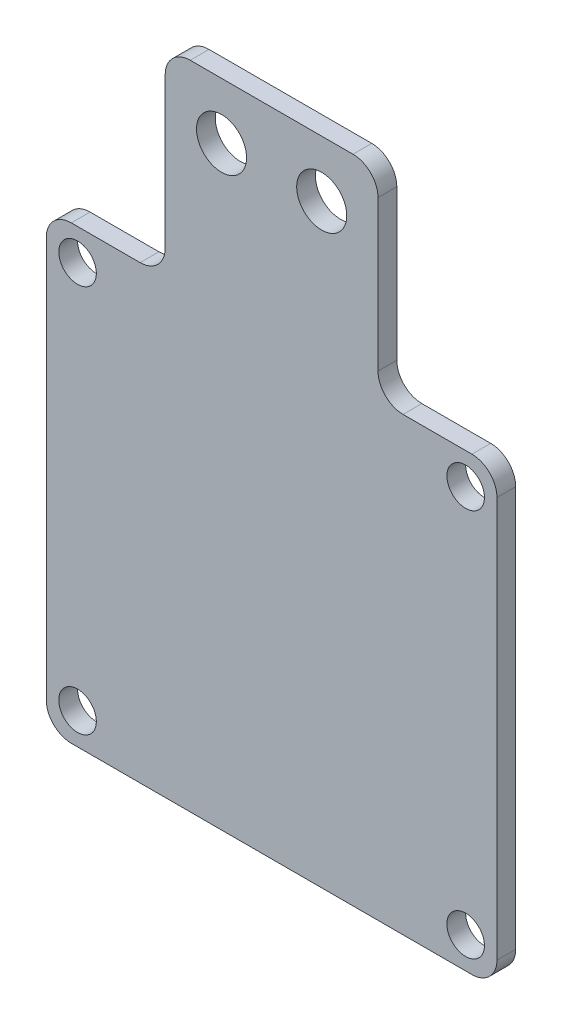
ISO-10303-21;
HEADER;
FILE_DESCRIPTION(('STEP AP214'),'2;1');
FILE_NAME('part.step','',(''),(''),'','','');
FILE_SCHEMA(('AUTOMOTIVE_DESIGN { 1 0 10303 214 1 1 1 1 }'));
ENDSEC;
DATA;
#1=APPLICATION_CONTEXT('core data for automotive mechanical design processes');
#2=APPLICATION_PROTOCOL_DEFINITION('international standard','automotive_design',2000,#1);
#3=PRODUCT_CONTEXT('',#1,'mechanical');
#4=PRODUCT('Part','Part','',(#3));
#5=PRODUCT_RELATED_PRODUCT_CATEGORY('part','',(#4));
#6=PRODUCT_DEFINITION_FORMATION('','',#4);
#7=PRODUCT_DEFINITION_CONTEXT('part definition',#1,'design');
#8=PRODUCT_DEFINITION('design','',#6,#7);
#9=PRODUCT_DEFINITION_SHAPE('','',#8);
#10=(LENGTH_UNIT() NAMED_UNIT(*) SI_UNIT(.MILLI.,.METRE.));
#11=(NAMED_UNIT(*) PLANE_ANGLE_UNIT() SI_UNIT($,.RADIAN.));
#12=(NAMED_UNIT(*) SI_UNIT($,.STERADIAN.) SOLID_ANGLE_UNIT());
#13=UNCERTAINTY_MEASURE_WITH_UNIT(LENGTH_MEASURE(1.E-05),#10,'distance_accuracy_value','');
#14=(GEOMETRIC_REPRESENTATION_CONTEXT(3) GLOBAL_UNCERTAINTY_ASSIGNED_CONTEXT((#13)) GLOBAL_UNIT_ASSIGNED_CONTEXT((#10,
#11,#12)) REPRESENTATION_CONTEXT('',''));
#15=CARTESIAN_POINT('',(0.,0.,0.));
#16=DIRECTION('',(0.,0.,1.));
#17=DIRECTION('',(1.,0.,0.));
#18=AXIS2_PLACEMENT_3D('',#15,#16,#17);
#19=CARTESIAN_POINT('',(10.5,38.,1.5));
#20=DIRECTION('',(0.,0.,1.));
#21=DIRECTION('',(1.,0.,0.));
#22=AXIS2_PLACEMENT_3D('',#19,#20,#21);
#23=PLANE('',#22);
#24=CARTESIAN_POINT('',(15.5,33.5,1.5));
#25=DIRECTION('',(0.,0.,1.));
#26=DIRECTION('',(-1.,0.,0.));
#27=AXIS2_PLACEMENT_3D('',#24,#25,#26);
#28=CIRCLE('',#27,1.5);
#29=CARTESIAN_POINT('',(14.,33.5,1.5));
#30=VERTEX_POINT('',#29);
#31=EDGE_CURVE('E354',#30,#30,#28,.T.);
#32=ORIENTED_EDGE('',*,*,#31,.F.);
#33=EDGE_LOOP('',(#32));
#34=FACE_BOUND('',#33,.T.);
#35=CARTESIAN_POINT('',(-4.,47.5,1.5));
#36=DIRECTION('',(0.,0.,1.));
#37=DIRECTION('',(1.,0.,0.));
#38=AXIS2_PLACEMENT_3D('',#35,#36,#37);
#39=CIRCLE('',#38,2.);
#40=CARTESIAN_POINT('',(-1.99999999999999,47.5,1.5));
#41=VERTEX_POINT('',#40);
#42=EDGE_CURVE('E366',#41,#41,#39,.T.);
#43=ORIENTED_EDGE('',*,*,#42,.F.);
#44=EDGE_LOOP('',(#43));
#45=FACE_BOUND('',#44,.T.);
#46=CARTESIAN_POINT('',(-15.5,2.5,1.5));
#47=DIRECTION('',(0.,0.,1.));
#48=DIRECTION('',(1.,0.,0.));
#49=AXIS2_PLACEMENT_3D('',#46,#47,#48);
#50=CIRCLE('',#49,1.5);
#51=CARTESIAN_POINT('',(-14.,2.5,1.5));
#52=VERTEX_POINT('',#51);
#53=EDGE_CURVE('E185',#52,#52,#50,.T.);
#54=ORIENTED_EDGE('',*,*,#53,.F.);
#55=EDGE_LOOP('',(#54));
#56=FACE_BOUND('',#55,.T.);
#57=CARTESIAN_POINT('',(10.5,38.,1.5));
#58=DIRECTION('',(0.,0.,-1.));
#59=DIRECTION('',(1.,0.,0.));
#60=AXIS2_PLACEMENT_3D('',#57,#58,#59);
#61=CIRCLE('',#60,2.);
#62=CARTESIAN_POINT('',(10.5,36.,1.5));
#63=VERTEX_POINT('',#62);
#64=CARTESIAN_POINT('',(8.5,38.,1.5));
#65=VERTEX_POINT('',#64);
#66=EDGE_CURVE('E214',#63,#65,#61,.T.);
#67=ORIENTED_EDGE('',*,*,#66,.T.);
#68=DIRECTION('',(0.,1.,0.));
#69=VECTOR('',#68,1.);
#70=CARTESIAN_POINT('',(8.5,38.,1.5));
#71=LINE('',#70,#69);
#72=CARTESIAN_POINT('',(8.5,50.,1.5));
#73=VERTEX_POINT('',#72);
#74=EDGE_CURVE('E120',#65,#73,#71,.T.);
#75=ORIENTED_EDGE('',*,*,#74,.T.);
#76=CARTESIAN_POINT('',(6.5,50.,1.5));
#77=DIRECTION('',(0.,0.,1.));
#78=DIRECTION('',(1.,0.,0.));
#79=AXIS2_PLACEMENT_3D('',#76,#77,#78);
#80=CIRCLE('',#79,2.);
#81=CARTESIAN_POINT('',(6.5,52.,1.5));
#82=VERTEX_POINT('',#81);
#83=EDGE_CURVE('E253',#73,#82,#80,.T.);
#84=ORIENTED_EDGE('',*,*,#83,.T.);
#85=DIRECTION('',(-1.,0.,0.));
#86=VECTOR('',#85,1.);
#87=CARTESIAN_POINT('',(6.5,52.,1.5));
#88=LINE('',#87,#86);
#89=CARTESIAN_POINT('',(-6.5,52.,1.5));
#90=VERTEX_POINT('',#89);
#91=EDGE_CURVE('E271',#82,#90,#88,.T.);
#92=ORIENTED_EDGE('',*,*,#91,.T.);
#93=CARTESIAN_POINT('',(-6.5,50.,1.5));
#94=DIRECTION('',(0.,0.,1.));
#95=DIRECTION('',(-1.,0.,0.));
#96=AXIS2_PLACEMENT_3D('',#93,#94,#95);
#97=CIRCLE('',#96,2.);
#98=CARTESIAN_POINT('',(-8.5,50.,1.5));
#99=VERTEX_POINT('',#98);
#100=EDGE_CURVE('E268',#90,#99,#97,.T.);
#101=ORIENTED_EDGE('',*,*,#100,.T.);
#102=DIRECTION('',(0.,-1.,0.));
#103=VECTOR('',#102,1.);
#104=CARTESIAN_POINT('',(-8.5,38.,1.5));
#105=LINE('',#104,#103);
#106=CARTESIAN_POINT('',(-8.5,38.,1.5));
#107=VERTEX_POINT('',#106);
#108=EDGE_CURVE('E270',#99,#107,#105,.T.);
#109=ORIENTED_EDGE('',*,*,#108,.T.);
#110=CARTESIAN_POINT('',(-10.5,38.,1.5));
#111=DIRECTION('',(0.,0.,-1.));
#112=DIRECTION('',(-1.,0.,0.));
#113=AXIS2_PLACEMENT_3D('',#110,#111,#112);
#114=CIRCLE('',#113,2.);
#115=CARTESIAN_POINT('',(-10.5,36.,1.5));
#116=VERTEX_POINT('',#115);
#117=EDGE_CURVE('E273',#107,#116,#114,.T.);
#118=ORIENTED_EDGE('',*,*,#117,.T.);
#119=DIRECTION('',(-1.,0.,0.));
#120=VECTOR('',#119,1.);
#121=CARTESIAN_POINT('',(-16.,36.,1.5));
#122=LINE('',#121,#120);
#123=CARTESIAN_POINT('',(-16.,36.,1.5));
#124=VERTEX_POINT('',#123);
#125=EDGE_CURVE('E279',#116,#124,#122,.T.);
#126=ORIENTED_EDGE('',*,*,#125,.T.);
#127=CARTESIAN_POINT('',(-16.,34.,1.5));
#128=DIRECTION('',(0.,0.,1.));
#129=DIRECTION('',(-1.,0.,0.));
#130=AXIS2_PLACEMENT_3D('',#127,#128,#129);
#131=CIRCLE('',#130,2.);
#132=CARTESIAN_POINT('',(-18.,34.,1.5));
#133=VERTEX_POINT('',#132);
#134=EDGE_CURVE('E281',#124,#133,#131,.T.);
#135=ORIENTED_EDGE('',*,*,#134,.T.);
#136=DIRECTION('',(0.,-1.,0.));
#137=VECTOR('',#136,1.);
#138=CARTESIAN_POINT('',(-18.,2.,1.5));
#139=LINE('',#138,#137);
#140=CARTESIAN_POINT('',(-18.,2.,1.5));
#141=VERTEX_POINT('',#140);
#142=EDGE_CURVE('E283',#133,#141,#139,.T.);
#143=ORIENTED_EDGE('',*,*,#142,.T.);
#144=CARTESIAN_POINT('',(-16.,2.,1.5));
#145=DIRECTION('',(0.,0.,1.));
#146=DIRECTION('',(-1.,0.,0.));
#147=AXIS2_PLACEMENT_3D('',#144,#145,#146);
#148=CIRCLE('',#147,2.);
#149=CARTESIAN_POINT('',(-16.,0.,1.5));
#150=VERTEX_POINT('',#149);
#151=EDGE_CURVE('E285',#141,#150,#148,.T.);
#152=ORIENTED_EDGE('',*,*,#151,.T.);
#153=DIRECTION('',(1.,0.,0.));
#154=VECTOR('',#153,1.);
#155=CARTESIAN_POINT('',(0.,0.,1.5));
#156=LINE('',#155,#154);
#157=CARTESIAN_POINT('',(16.,0.,1.5));
#158=VERTEX_POINT('',#157);
#159=EDGE_CURVE('E287',#150,#158,#156,.T.);
#160=ORIENTED_EDGE('',*,*,#159,.T.);
#161=CARTESIAN_POINT('',(16.,2.,1.5));
#162=DIRECTION('',(0.,0.,1.));
#163=DIRECTION('',(1.,0.,0.));
#164=AXIS2_PLACEMENT_3D('',#161,#162,#163);
#165=CIRCLE('',#164,2.);
#166=CARTESIAN_POINT('',(18.,2.,1.5));
#167=VERTEX_POINT('',#166);
#168=EDGE_CURVE('E163',#158,#167,#165,.T.);
#169=ORIENTED_EDGE('',*,*,#168,.T.);
#170=DIRECTION('',(0.,1.,0.));
#171=VECTOR('',#170,1.);
#172=CARTESIAN_POINT('',(18.,2.,1.5));
#173=LINE('',#172,#171);
#174=CARTESIAN_POINT('',(18.,34.,1.5));
#175=VERTEX_POINT('',#174);
#176=EDGE_CURVE('E157',#167,#175,#173,.T.);
#177=ORIENTED_EDGE('',*,*,#176,.T.);
#178=CARTESIAN_POINT('',(16.,34.,1.5));
#179=DIRECTION('',(0.,0.,1.));
#180=DIRECTION('',(1.,0.,0.));
#181=AXIS2_PLACEMENT_3D('',#178,#179,#180);
#182=CIRCLE('',#181,2.);
#183=CARTESIAN_POINT('',(16.,36.,1.5));
#184=VERTEX_POINT('',#183);
#185=EDGE_CURVE('E161',#175,#184,#182,.T.);
#186=ORIENTED_EDGE('',*,*,#185,.T.);
#187=DIRECTION('',(-1.,0.,0.));
#188=VECTOR('',#187,1.);
#189=CARTESIAN_POINT('',(16.,36.,1.5));
#190=LINE('',#189,#188);
#191=EDGE_CURVE('E53',#184,#63,#190,.T.);
#192=ORIENTED_EDGE('',*,*,#191,.T.);
#193=EDGE_LOOP('',(#67,#75,#84,#92,#101,#109,#118,#126,#135,#143,#152,#160,#169,#177,#186,#192));
#194=FACE_BOUND('',#193,.T.);
#195=CARTESIAN_POINT('',(-15.5,33.5,1.5));
#196=DIRECTION('',(0.,0.,1.));
#197=DIRECTION('',(1.,0.,0.));
#198=AXIS2_PLACEMENT_3D('',#195,#196,#197);
#199=CIRCLE('',#198,1.5);
#200=CARTESIAN_POINT('',(-14.,33.5,1.5));
#201=VERTEX_POINT('',#200);
#202=EDGE_CURVE('E372',#201,#201,#199,.T.);
#203=ORIENTED_EDGE('',*,*,#202,.F.);
#204=EDGE_LOOP('',(#203));
#205=FACE_BOUND('',#204,.T.);
#206=CARTESIAN_POINT('',(4.,47.5,1.5));
#207=DIRECTION('',(0.,0.,1.));
#208=DIRECTION('',(-1.,0.,0.));
#209=AXIS2_PLACEMENT_3D('',#206,#207,#208);
#210=CIRCLE('',#209,2.);
#211=CARTESIAN_POINT('',(1.99999999999999,47.5,1.5));
#212=VERTEX_POINT('',#211);
#213=EDGE_CURVE('E360',#212,#212,#210,.T.);
#214=ORIENTED_EDGE('',*,*,#213,.F.);
#215=EDGE_LOOP('',(#214));
#216=FACE_BOUND('',#215,.T.);
#217=CARTESIAN_POINT('',(15.5,2.5,1.5));
#218=DIRECTION('',(0.,0.,1.));
#219=DIRECTION('',(-1.,0.,0.));
#220=AXIS2_PLACEMENT_3D('',#217,#218,#219);
#221=CIRCLE('',#220,1.5);
#222=CARTESIAN_POINT('',(14.,2.5,1.5));
#223=VERTEX_POINT('',#222);
#224=EDGE_CURVE('E345',#223,#223,#221,.T.);
#225=ORIENTED_EDGE('',*,*,#224,.F.);
#226=EDGE_LOOP('',(#225));
#227=FACE_BOUND('',#226,.T.);
#228=ADVANCED_FACE('F36',(#34,#45,#56,#194,#205,#216,#227),#23,.T.);
#229=CARTESIAN_POINT('',(10.5,38.,0.));
#230=DIRECTION('',(0.,0.,1.));
#231=DIRECTION('',(1.,0.,0.));
#232=AXIS2_PLACEMENT_3D('',#229,#230,#231);
#233=PLANE('',#232);
#234=CARTESIAN_POINT('',(10.5,38.,0.));
#235=DIRECTION('',(0.,0.,-1.));
#236=DIRECTION('',(1.,0.,0.));
#237=AXIS2_PLACEMENT_3D('',#234,#235,#236);
#238=CIRCLE('',#237,2.);
#239=CARTESIAN_POINT('',(10.5,36.,0.));
#240=VERTEX_POINT('',#239);
#241=CARTESIAN_POINT('',(8.5,38.,0.));
#242=VERTEX_POINT('',#241);
#243=EDGE_CURVE('E181',#240,#242,#238,.T.);
#244=ORIENTED_EDGE('',*,*,#243,.F.);
#245=DIRECTION('',(-1.,0.,0.));
#246=VECTOR('',#245,1.);
#247=CARTESIAN_POINT('',(16.,36.,0.));
#248=LINE('',#247,#246);
#249=CARTESIAN_POINT('',(16.,36.,0.));
#250=VERTEX_POINT('',#249);
#251=EDGE_CURVE('E112',#250,#240,#248,.T.);
#252=ORIENTED_EDGE('',*,*,#251,.F.);
#253=CARTESIAN_POINT('',(16.,34.,0.));
#254=DIRECTION('',(0.,0.,1.));
#255=DIRECTION('',(1.,0.,0.));
#256=AXIS2_PLACEMENT_3D('',#253,#254,#255);
#257=CIRCLE('',#256,2.);
#258=CARTESIAN_POINT('',(18.,34.,0.));
#259=VERTEX_POINT('',#258);
#260=EDGE_CURVE('E106',#259,#250,#257,.T.);
#261=ORIENTED_EDGE('',*,*,#260,.F.);
#262=DIRECTION('',(0.,1.,0.));
#263=VECTOR('',#262,1.);
#264=CARTESIAN_POINT('',(18.,2.,0.));
#265=LINE('',#264,#263);
#266=CARTESIAN_POINT('',(18.,2.,0.));
#267=VERTEX_POINT('',#266);
#268=EDGE_CURVE('E171',#267,#259,#265,.T.);
#269=ORIENTED_EDGE('',*,*,#268,.F.);
#270=CARTESIAN_POINT('',(16.,2.,0.));
#271=DIRECTION('',(0.,0.,1.));
#272=DIRECTION('',(1.,0.,0.));
#273=AXIS2_PLACEMENT_3D('',#270,#271,#272);
#274=CIRCLE('',#273,2.);
#275=CARTESIAN_POINT('',(16.,0.,0.));
#276=VERTEX_POINT('',#275);
#277=EDGE_CURVE('E209',#276,#267,#274,.T.);
#278=ORIENTED_EDGE('',*,*,#277,.F.);
#279=DIRECTION('',(1.,0.,0.));
#280=VECTOR('',#279,1.);
#281=CARTESIAN_POINT('',(0.,0.,0.));
#282=LINE('',#281,#280);
#283=CARTESIAN_POINT('',(-16.,0.,0.));
#284=VERTEX_POINT('',#283);
#285=EDGE_CURVE('E207',#284,#276,#282,.T.);
#286=ORIENTED_EDGE('',*,*,#285,.F.);
#287=CARTESIAN_POINT('',(-16.,2.,0.));
#288=DIRECTION('',(0.,0.,1.));
#289=DIRECTION('',(-1.,0.,0.));
#290=AXIS2_PLACEMENT_3D('',#287,#288,#289);
#291=CIRCLE('',#290,2.);
#292=CARTESIAN_POINT('',(-18.,2.,0.));
#293=VERTEX_POINT('',#292);
#294=EDGE_CURVE('E204',#293,#284,#291,.T.);
#295=ORIENTED_EDGE('',*,*,#294,.F.);
#296=DIRECTION('',(0.,-1.,0.));
#297=VECTOR('',#296,1.);
#298=CARTESIAN_POINT('',(-18.,2.,0.));
#299=LINE('',#298,#297);
#300=CARTESIAN_POINT('',(-18.,34.,0.));
#301=VERTEX_POINT('',#300);
#302=EDGE_CURVE('E202',#301,#293,#299,.T.);
#303=ORIENTED_EDGE('',*,*,#302,.F.);
#304=CARTESIAN_POINT('',(-16.,34.,0.));
#305=DIRECTION('',(0.,0.,1.));
#306=DIRECTION('',(-1.,0.,0.));
#307=AXIS2_PLACEMENT_3D('',#304,#305,#306);
#308=CIRCLE('',#307,2.);
#309=CARTESIAN_POINT('',(-16.,36.,0.));
#310=VERTEX_POINT('',#309);
#311=EDGE_CURVE('E200',#310,#301,#308,.T.);
#312=ORIENTED_EDGE('',*,*,#311,.F.);
#313=DIRECTION('',(-1.,0.,0.));
#314=VECTOR('',#313,1.);
#315=CARTESIAN_POINT('',(-16.,36.,0.));
#316=LINE('',#315,#314);
#317=CARTESIAN_POINT('',(-10.5,36.,0.));
#318=VERTEX_POINT('',#317);
#319=EDGE_CURVE('E198',#318,#310,#316,.T.);
#320=ORIENTED_EDGE('',*,*,#319,.F.);
#321=CARTESIAN_POINT('',(-10.5,38.,0.));
#322=DIRECTION('',(0.,0.,-1.));
#323=DIRECTION('',(-1.,0.,0.));
#324=AXIS2_PLACEMENT_3D('',#321,#322,#323);
#325=CIRCLE('',#324,2.);
#326=CARTESIAN_POINT('',(-8.5,38.,0.));
#327=VERTEX_POINT('',#326);
#328=EDGE_CURVE('E196',#327,#318,#325,.T.);
#329=ORIENTED_EDGE('',*,*,#328,.F.);
#330=DIRECTION('',(0.,-1.,0.));
#331=VECTOR('',#330,1.);
#332=CARTESIAN_POINT('',(-8.5,38.,0.));
#333=LINE('',#332,#331);
#334=CARTESIAN_POINT('',(-8.5,50.,0.));
#335=VERTEX_POINT('',#334);
#336=EDGE_CURVE('E194',#335,#327,#333,.T.);
#337=ORIENTED_EDGE('',*,*,#336,.F.);
#338=CARTESIAN_POINT('',(-6.5,50.,0.));
#339=DIRECTION('',(0.,0.,1.));
#340=DIRECTION('',(-1.,0.,0.));
#341=AXIS2_PLACEMENT_3D('',#338,#339,#340);
#342=CIRCLE('',#341,2.);
#343=CARTESIAN_POINT('',(-6.5,52.,0.));
#344=VERTEX_POINT('',#343);
#345=EDGE_CURVE('E192',#344,#335,#342,.T.);
#346=ORIENTED_EDGE('',*,*,#345,.F.);
#347=DIRECTION('',(-1.,0.,0.));
#348=VECTOR('',#347,1.);
#349=CARTESIAN_POINT('',(-6.5,52.,0.));
#350=LINE('',#349,#348);
#351=CARTESIAN_POINT('',(6.5,52.,0.));
#352=VERTEX_POINT('',#351);
#353=EDGE_CURVE('E190',#352,#344,#350,.T.);
#354=ORIENTED_EDGE('',*,*,#353,.F.);
#355=CARTESIAN_POINT('',(6.5,50.,0.));
#356=DIRECTION('',(0.,0.,1.));
#357=DIRECTION('',(1.,0.,0.));
#358=AXIS2_PLACEMENT_3D('',#355,#356,#357);
#359=CIRCLE('',#358,2.);
#360=CARTESIAN_POINT('',(8.5,50.,0.));
#361=VERTEX_POINT('',#360);
#362=EDGE_CURVE('E187',#361,#352,#359,.T.);
#363=ORIENTED_EDGE('',*,*,#362,.F.);
#364=DIRECTION('',(0.,1.,0.));
#365=VECTOR('',#364,1.);
#366=CARTESIAN_POINT('',(8.5,38.,0.));
#367=LINE('',#366,#365);
#368=EDGE_CURVE('E184',#242,#361,#367,.T.);
#369=ORIENTED_EDGE('',*,*,#368,.F.);
#370=EDGE_LOOP('',(#244,#252,#261,#269,#278,#286,#295,#303,#312,#320,#329,#337,#346,#354,#363,#369));
#371=FACE_BOUND('',#370,.T.);
#372=CARTESIAN_POINT('',(-15.5,2.5,0.));
#373=DIRECTION('',(0.,0.,1.));
#374=DIRECTION('',(1.,0.,0.));
#375=AXIS2_PLACEMENT_3D('',#372,#373,#374);
#376=CIRCLE('',#375,1.5);
#377=CARTESIAN_POINT('',(-14.,2.5,0.));
#378=VERTEX_POINT('',#377);
#379=EDGE_CURVE('E375',#378,#378,#376,.T.);
#380=ORIENTED_EDGE('',*,*,#379,.T.);
#381=EDGE_LOOP('',(#380));
#382=FACE_BOUND('',#381,.T.);
#383=CARTESIAN_POINT('',(-15.5,33.5,0.));
#384=DIRECTION('',(0.,0.,1.));
#385=DIRECTION('',(1.,0.,0.));
#386=AXIS2_PLACEMENT_3D('',#383,#384,#385);
#387=CIRCLE('',#386,1.5);
#388=CARTESIAN_POINT('',(-14.,33.5,0.));
#389=VERTEX_POINT('',#388);
#390=EDGE_CURVE('E369',#389,#389,#387,.T.);
#391=ORIENTED_EDGE('',*,*,#390,.T.);
#392=EDGE_LOOP('',(#391));
#393=FACE_BOUND('',#392,.T.);
#394=CARTESIAN_POINT('',(-4.,47.5,0.));
#395=DIRECTION('',(0.,0.,1.));
#396=DIRECTION('',(1.,0.,0.));
#397=AXIS2_PLACEMENT_3D('',#394,#395,#396);
#398=CIRCLE('',#397,2.);
#399=CARTESIAN_POINT('',(-1.99999999999999,47.5,0.));
#400=VERTEX_POINT('',#399);
#401=EDGE_CURVE('E363',#400,#400,#398,.T.);
#402=ORIENTED_EDGE('',*,*,#401,.T.);
#403=EDGE_LOOP('',(#402));
#404=FACE_BOUND('',#403,.T.);
#405=CARTESIAN_POINT('',(4.,47.5,0.));
#406=DIRECTION('',(0.,0.,1.));
#407=DIRECTION('',(-1.,0.,0.));
#408=AXIS2_PLACEMENT_3D('',#405,#406,#407);
#409=CIRCLE('',#408,2.);
#410=CARTESIAN_POINT('',(1.99999999999999,47.5,0.));
#411=VERTEX_POINT('',#410);
#412=EDGE_CURVE('E357',#411,#411,#409,.T.);
#413=ORIENTED_EDGE('',*,*,#412,.T.);
#414=EDGE_LOOP('',(#413));
#415=FACE_BOUND('',#414,.T.);
#416=CARTESIAN_POINT('',(15.5,33.5,0.));
#417=DIRECTION('',(0.,0.,1.));
#418=DIRECTION('',(-1.,0.,0.));
#419=AXIS2_PLACEMENT_3D('',#416,#417,#418);
#420=CIRCLE('',#419,1.5);
#421=CARTESIAN_POINT('',(14.,33.5,0.));
#422=VERTEX_POINT('',#421);
#423=EDGE_CURVE('E351',#422,#422,#420,.T.);
#424=ORIENTED_EDGE('',*,*,#423,.T.);
#425=EDGE_LOOP('',(#424));
#426=FACE_BOUND('',#425,.T.);
#427=CARTESIAN_POINT('',(15.5,2.5,0.));
#428=DIRECTION('',(0.,0.,1.));
#429=DIRECTION('',(-1.,0.,0.));
#430=AXIS2_PLACEMENT_3D('',#427,#428,#429);
#431=CIRCLE('',#430,1.5);
#432=CARTESIAN_POINT('',(14.,2.5,0.));
#433=VERTEX_POINT('',#432);
#434=EDGE_CURVE('E348',#433,#433,#431,.T.);
#435=ORIENTED_EDGE('',*,*,#434,.T.);
#436=EDGE_LOOP('',(#435));
#437=FACE_BOUND('',#436,.T.);
#438=ADVANCED_FACE('F256',(#371,#382,#393,#404,#415,#426,#437),#233,.F.);
#439=CARTESIAN_POINT('',(10.5,38.,1.5));
#440=DIRECTION('',(0.,0.,-1.));
#441=DIRECTION('',(-1.,0.,0.));
#442=AXIS2_PLACEMENT_3D('',#439,#440,#441);
#443=CYLINDRICAL_SURFACE('',#442,2.);
#444=ORIENTED_EDGE('',*,*,#243,.T.);
#445=DIRECTION('',(0.,0.,-1.));
#446=VECTOR('',#445,1.);
#447=CARTESIAN_POINT('',(8.5,38.,1.5));
#448=LINE('',#447,#446);
#449=EDGE_CURVE('E11',#65,#242,#448,.T.);
#450=ORIENTED_EDGE('',*,*,#449,.F.);
#451=ORIENTED_EDGE('',*,*,#66,.F.);
#452=DIRECTION('',(0.,0.,-1.));
#453=VECTOR('',#452,1.);
#454=CARTESIAN_POINT('',(10.5,36.,1.5));
#455=LINE('',#454,#453);
#456=EDGE_CURVE('E177',#63,#240,#455,.T.);
#457=ORIENTED_EDGE('',*,*,#456,.T.);
#458=EDGE_LOOP('',(#444,#450,#451,#457));
#459=FACE_BOUND('',#458,.T.);
#460=ADVANCED_FACE('F38',(#459),#443,.F.);
#461=CARTESIAN_POINT('',(8.5,38.,1.5));
#462=DIRECTION('',(-1.,0.,0.));
#463=DIRECTION('',(0.,0.,1.));
#464=AXIS2_PLACEMENT_3D('',#461,#462,#463);
#465=PLANE('',#464);
#466=ORIENTED_EDGE('',*,*,#368,.T.);
#467=DIRECTION('',(0.,0.,-1.));
#468=VECTOR('',#467,1.);
#469=CARTESIAN_POINT('',(8.5,50.,1.5));
#470=LINE('',#469,#468);
#471=EDGE_CURVE('E45',#73,#361,#470,.T.);
#472=ORIENTED_EDGE('',*,*,#471,.F.);
#473=ORIENTED_EDGE('',*,*,#74,.F.);
#474=ORIENTED_EDGE('',*,*,#449,.T.);
#475=EDGE_LOOP('',(#466,#472,#473,#474));
#476=FACE_BOUND('',#475,.T.);
#477=ADVANCED_FACE('F545',(#476),#465,.F.);
#478=CARTESIAN_POINT('',(6.5,50.,1.5));
#479=DIRECTION('',(0.,0.,-1.));
#480=DIRECTION('',(-1.,0.,0.));
#481=AXIS2_PLACEMENT_3D('',#478,#479,#480);
#482=CYLINDRICAL_SURFACE('',#481,2.);
#483=ORIENTED_EDGE('',*,*,#362,.T.);
#484=DIRECTION('',(0.,0.,-1.));
#485=VECTOR('',#484,1.);
#486=CARTESIAN_POINT('',(6.5,52.,1.5));
#487=LINE('',#486,#485);
#488=EDGE_CURVE('E245',#82,#352,#487,.T.);
#489=ORIENTED_EDGE('',*,*,#488,.F.);
#490=ORIENTED_EDGE('',*,*,#83,.F.);
#491=ORIENTED_EDGE('',*,*,#471,.T.);
#492=EDGE_LOOP('',(#483,#489,#490,#491));
#493=FACE_BOUND('',#492,.T.);
#494=ADVANCED_FACE('F251',(#493),#482,.T.);
#495=CARTESIAN_POINT('',(-6.5,52.,1.5));
#496=DIRECTION('',(0.,-1.,0.));
#497=DIRECTION('',(1.,0.,0.));
#498=AXIS2_PLACEMENT_3D('',#495,#496,#497);
#499=PLANE('',#498);
#500=ORIENTED_EDGE('',*,*,#353,.T.);
#501=DIRECTION('',(0.,0.,-1.));
#502=VECTOR('',#501,1.);
#503=CARTESIAN_POINT('',(-6.5,52.,1.5));
#504=LINE('',#503,#502);
#505=EDGE_CURVE('E242',#90,#344,#504,.T.);
#506=ORIENTED_EDGE('',*,*,#505,.F.);
#507=ORIENTED_EDGE('',*,*,#91,.F.);
#508=ORIENTED_EDGE('',*,*,#488,.T.);
#509=EDGE_LOOP('',(#500,#506,#507,#508));
#510=FACE_BOUND('',#509,.T.);
#511=ADVANCED_FACE('F262',(#510),#499,.F.);
#512=CARTESIAN_POINT('',(-6.5,50.,1.5));
#513=DIRECTION('',(0.,0.,-1.));
#514=DIRECTION('',(-1.,0.,0.));
#515=AXIS2_PLACEMENT_3D('',#512,#513,#514);
#516=CYLINDRICAL_SURFACE('',#515,2.);
#517=ORIENTED_EDGE('',*,*,#345,.T.);
#518=DIRECTION('',(0.,0.,-1.));
#519=VECTOR('',#518,1.);
#520=CARTESIAN_POINT('',(-8.5,50.,1.5));
#521=LINE('',#520,#519);
#522=EDGE_CURVE('E239',#99,#335,#521,.T.);
#523=ORIENTED_EDGE('',*,*,#522,.F.);
#524=ORIENTED_EDGE('',*,*,#100,.F.);
#525=ORIENTED_EDGE('',*,*,#505,.T.);
#526=EDGE_LOOP('',(#517,#523,#524,#525));
#527=FACE_BOUND('',#526,.T.);
#528=ADVANCED_FACE('F266',(#527),#516,.T.);
#529=CARTESIAN_POINT('',(-8.5,38.,1.5));
#530=DIRECTION('',(1.,0.,0.));
#531=DIRECTION('',(0.,0.,-1.));
#532=AXIS2_PLACEMENT_3D('',#529,#530,#531);
#533=PLANE('',#532);
#534=ORIENTED_EDGE('',*,*,#336,.T.);
#535=DIRECTION('',(0.,0.,-1.));
#536=VECTOR('',#535,1.);
#537=CARTESIAN_POINT('',(-8.5,38.,1.5));
#538=LINE('',#537,#536);
#539=EDGE_CURVE('E236',#107,#327,#538,.T.);
#540=ORIENTED_EDGE('',*,*,#539,.F.);
#541=ORIENTED_EDGE('',*,*,#108,.F.);
#542=ORIENTED_EDGE('',*,*,#522,.T.);
#543=EDGE_LOOP('',(#534,#540,#541,#542));
#544=FACE_BOUND('',#543,.T.);
#545=ADVANCED_FACE('F509',(#544),#533,.F.);
#546=CARTESIAN_POINT('',(-10.5,38.,1.5));
#547=DIRECTION('',(0.,0.,-1.));
#548=DIRECTION('',(-1.,0.,0.));
#549=AXIS2_PLACEMENT_3D('',#546,#547,#548);
#550=CYLINDRICAL_SURFACE('',#549,2.);
#551=ORIENTED_EDGE('',*,*,#328,.T.);
#552=DIRECTION('',(0.,0.,-1.));
#553=VECTOR('',#552,1.);
#554=CARTESIAN_POINT('',(-10.5,36.,1.5));
#555=LINE('',#554,#553);
#556=EDGE_CURVE('E233',#116,#318,#555,.T.);
#557=ORIENTED_EDGE('',*,*,#556,.F.);
#558=ORIENTED_EDGE('',*,*,#117,.F.);
#559=ORIENTED_EDGE('',*,*,#539,.T.);
#560=EDGE_LOOP('',(#551,#557,#558,#559));
#561=FACE_BOUND('',#560,.T.);
#562=ADVANCED_FACE('F499',(#561),#550,.F.);
#563=CARTESIAN_POINT('',(-16.,36.,1.5));
#564=DIRECTION('',(0.,-1.,0.));
#565=DIRECTION('',(1.,0.,0.));
#566=AXIS2_PLACEMENT_3D('',#563,#564,#565);
#567=PLANE('',#566);
#568=ORIENTED_EDGE('',*,*,#319,.T.);
#569=DIRECTION('',(0.,0.,-1.));
#570=VECTOR('',#569,1.);
#571=CARTESIAN_POINT('',(-16.,36.,1.5));
#572=LINE('',#571,#570);
#573=EDGE_CURVE('E230',#124,#310,#572,.T.);
#574=ORIENTED_EDGE('',*,*,#573,.F.);
#575=ORIENTED_EDGE('',*,*,#125,.F.);
#576=ORIENTED_EDGE('',*,*,#556,.T.);
#577=EDGE_LOOP('',(#568,#574,#575,#576));
#578=FACE_BOUND('',#577,.T.);
#579=ADVANCED_FACE('F489',(#578),#567,.F.);
#580=CARTESIAN_POINT('',(-16.,34.,1.5));
#581=DIRECTION('',(0.,0.,-1.));
#582=DIRECTION('',(-1.,0.,0.));
#583=AXIS2_PLACEMENT_3D('',#580,#581,#582);
#584=CYLINDRICAL_SURFACE('',#583,2.);
#585=ORIENTED_EDGE('',*,*,#311,.T.);
#586=DIRECTION('',(0.,0.,-1.));
#587=VECTOR('',#586,1.);
#588=CARTESIAN_POINT('',(-18.,34.,1.5));
#589=LINE('',#588,#587);
#590=EDGE_CURVE('E227',#133,#301,#589,.T.);
#591=ORIENTED_EDGE('',*,*,#590,.F.);
#592=ORIENTED_EDGE('',*,*,#134,.F.);
#593=ORIENTED_EDGE('',*,*,#573,.T.);
#594=EDGE_LOOP('',(#585,#591,#592,#593));
#595=FACE_BOUND('',#594,.T.);
#596=ADVANCED_FACE('F479',(#595),#584,.T.);
#597=CARTESIAN_POINT('',(-18.,2.,1.5));
#598=DIRECTION('',(1.,0.,0.));
#599=DIRECTION('',(0.,0.,-1.));
#600=AXIS2_PLACEMENT_3D('',#597,#598,#599);
#601=PLANE('',#600);
#602=ORIENTED_EDGE('',*,*,#302,.T.);
#603=DIRECTION('',(0.,0.,-1.));
#604=VECTOR('',#603,1.);
#605=CARTESIAN_POINT('',(-18.,2.,1.5));
#606=LINE('',#605,#604);
#607=EDGE_CURVE('E224',#141,#293,#606,.T.);
#608=ORIENTED_EDGE('',*,*,#607,.F.);
#609=ORIENTED_EDGE('',*,*,#142,.F.);
#610=ORIENTED_EDGE('',*,*,#590,.T.);
#611=EDGE_LOOP('',(#602,#608,#609,#610));
#612=FACE_BOUND('',#611,.T.);
#613=ADVANCED_FACE('F469',(#612),#601,.F.);
#614=CARTESIAN_POINT('',(-16.,2.,1.5));
#615=DIRECTION('',(0.,0.,-1.));
#616=DIRECTION('',(-1.,0.,0.));
#617=AXIS2_PLACEMENT_3D('',#614,#615,#616);
#618=CYLINDRICAL_SURFACE('',#617,2.);
#619=ORIENTED_EDGE('',*,*,#294,.T.);
#620=DIRECTION('',(0.,0.,-1.));
#621=VECTOR('',#620,1.);
#622=CARTESIAN_POINT('',(-16.,0.,1.5));
#623=LINE('',#622,#621);
#624=EDGE_CURVE('E221',#150,#284,#623,.T.);
#625=ORIENTED_EDGE('',*,*,#624,.F.);
#626=ORIENTED_EDGE('',*,*,#151,.F.);
#627=ORIENTED_EDGE('',*,*,#607,.T.);
#628=EDGE_LOOP('',(#619,#625,#626,#627));
#629=FACE_BOUND('',#628,.T.);
#630=ADVANCED_FACE('F459',(#629),#618,.T.);
#631=CARTESIAN_POINT('',(0.,0.,1.5));
#632=DIRECTION('',(0.,1.,0.));
#633=DIRECTION('',(-1.,0.,0.));
#634=AXIS2_PLACEMENT_3D('',#631,#632,#633);
#635=PLANE('',#634);
#636=ORIENTED_EDGE('',*,*,#285,.T.);
#637=DIRECTION('',(0.,0.,-1.));
#638=VECTOR('',#637,1.);
#639=CARTESIAN_POINT('',(16.,0.,1.5));
#640=LINE('',#639,#638);
#641=EDGE_CURVE('E218',#158,#276,#640,.T.);
#642=ORIENTED_EDGE('',*,*,#641,.F.);
#643=ORIENTED_EDGE('',*,*,#159,.F.);
#644=ORIENTED_EDGE('',*,*,#624,.T.);
#645=EDGE_LOOP('',(#636,#642,#643,#644));
#646=FACE_BOUND('',#645,.T.);
#647=ADVANCED_FACE('F293',(#646),#635,.F.);
#648=CARTESIAN_POINT('',(16.,2.,1.5));
#649=DIRECTION('',(0.,0.,-1.));
#650=DIRECTION('',(-1.,0.,0.));
#651=AXIS2_PLACEMENT_3D('',#648,#649,#650);
#652=CYLINDRICAL_SURFACE('',#651,2.);
#653=ORIENTED_EDGE('',*,*,#277,.T.);
#654=DIRECTION('',(0.,0.,-1.));
#655=VECTOR('',#654,1.);
#656=CARTESIAN_POINT('',(18.,2.,1.5));
#657=LINE('',#656,#655);
#658=EDGE_CURVE('E172',#167,#267,#657,.T.);
#659=ORIENTED_EDGE('',*,*,#658,.F.);
#660=ORIENTED_EDGE('',*,*,#168,.F.);
#661=ORIENTED_EDGE('',*,*,#641,.T.);
#662=EDGE_LOOP('',(#653,#659,#660,#661));
#663=FACE_BOUND('',#662,.T.);
#664=ADVANCED_FACE('F296',(#663),#652,.T.);
#665=CARTESIAN_POINT('',(18.,2.,1.5));
#666=DIRECTION('',(-1.,0.,0.));
#667=DIRECTION('',(0.,0.,1.));
#668=AXIS2_PLACEMENT_3D('',#665,#666,#667);
#669=PLANE('',#668);
#670=ORIENTED_EDGE('',*,*,#268,.T.);
#671=DIRECTION('',(0.,0.,-1.));
#672=VECTOR('',#671,1.);
#673=CARTESIAN_POINT('',(18.,34.,1.5));
#674=LINE('',#673,#672);
#675=EDGE_CURVE('E168',#175,#259,#674,.T.);
#676=ORIENTED_EDGE('',*,*,#675,.F.);
#677=ORIENTED_EDGE('',*,*,#176,.F.);
#678=ORIENTED_EDGE('',*,*,#658,.T.);
#679=EDGE_LOOP('',(#670,#676,#677,#678));
#680=FACE_BOUND('',#679,.T.);
#681=ADVANCED_FACE('F169',(#680),#669,.F.);
#682=CARTESIAN_POINT('',(16.,34.,1.5));
#683=DIRECTION('',(0.,0.,-1.));
#684=DIRECTION('',(-1.,0.,0.));
#685=AXIS2_PLACEMENT_3D('',#682,#683,#684);
#686=CYLINDRICAL_SURFACE('',#685,2.);
#687=ORIENTED_EDGE('',*,*,#260,.T.);
#688=DIRECTION('',(0.,0.,-1.));
#689=VECTOR('',#688,1.);
#690=CARTESIAN_POINT('',(16.,36.,1.5));
#691=LINE('',#690,#689);
#692=EDGE_CURVE('E173',#184,#250,#691,.T.);
#693=ORIENTED_EDGE('',*,*,#692,.F.);
#694=ORIENTED_EDGE('',*,*,#185,.F.);
#695=ORIENTED_EDGE('',*,*,#675,.T.);
#696=EDGE_LOOP('',(#687,#693,#694,#695));
#697=FACE_BOUND('',#696,.T.);
#698=ADVANCED_FACE('F175',(#697),#686,.T.);
#699=CARTESIAN_POINT('',(16.,36.,1.5));
#700=DIRECTION('',(0.,-1.,0.));
#701=DIRECTION('',(1.,0.,0.));
#702=AXIS2_PLACEMENT_3D('',#699,#700,#701);
#703=PLANE('',#702);
#704=ORIENTED_EDGE('',*,*,#251,.T.);
#705=ORIENTED_EDGE('',*,*,#456,.F.);
#706=ORIENTED_EDGE('',*,*,#191,.F.);
#707=ORIENTED_EDGE('',*,*,#692,.T.);
#708=EDGE_LOOP('',(#704,#705,#706,#707));
#709=FACE_BOUND('',#708,.T.);
#710=ADVANCED_FACE('F300',(#709),#703,.F.);
#711=CARTESIAN_POINT('',(-15.5,2.5,1.5));
#712=DIRECTION('',(0.,0.,-1.));
#713=DIRECTION('',(-1.,0.,0.));
#714=AXIS2_PLACEMENT_3D('',#711,#712,#713);
#715=CYLINDRICAL_SURFACE('',#714,1.5);
#716=ORIENTED_EDGE('',*,*,#53,.T.);
#717=EDGE_LOOP('',(#716));
#718=FACE_BOUND('',#717,.T.);
#719=ORIENTED_EDGE('',*,*,#379,.F.);
#720=EDGE_LOOP('',(#719));
#721=FACE_BOUND('',#720,.T.);
#722=ADVANCED_FACE('F302',(#718,#721),#715,.F.);
#723=CARTESIAN_POINT('',(-15.5,33.5,1.5));
#724=DIRECTION('',(0.,0.,-1.));
#725=DIRECTION('',(-1.,0.,0.));
#726=AXIS2_PLACEMENT_3D('',#723,#724,#725);
#727=CYLINDRICAL_SURFACE('',#726,1.5);
#728=ORIENTED_EDGE('',*,*,#202,.T.);
#729=EDGE_LOOP('',(#728));
#730=FACE_BOUND('',#729,.T.);
#731=ORIENTED_EDGE('',*,*,#390,.F.);
#732=EDGE_LOOP('',(#731));
#733=FACE_BOUND('',#732,.T.);
#734=ADVANCED_FACE('F308',(#730,#733),#727,.F.);
#735=CARTESIAN_POINT('',(-4.,47.5,1.5));
#736=DIRECTION('',(0.,0.,-1.));
#737=DIRECTION('',(-1.,0.,0.));
#738=AXIS2_PLACEMENT_3D('',#735,#736,#737);
#739=CYLINDRICAL_SURFACE('',#738,2.);
#740=ORIENTED_EDGE('',*,*,#42,.T.);
#741=EDGE_LOOP('',(#740));
#742=FACE_BOUND('',#741,.T.);
#743=ORIENTED_EDGE('',*,*,#401,.F.);
#744=EDGE_LOOP('',(#743));
#745=FACE_BOUND('',#744,.T.);
#746=ADVANCED_FACE('F324',(#742,#745),#739,.F.);
#747=CARTESIAN_POINT('',(4.,47.5,1.5));
#748=DIRECTION('',(0.,0.,-1.));
#749=DIRECTION('',(-1.,0.,0.));
#750=AXIS2_PLACEMENT_3D('',#747,#748,#749);
#751=CYLINDRICAL_SURFACE('',#750,2.);
#752=ORIENTED_EDGE('',*,*,#213,.T.);
#753=EDGE_LOOP('',(#752));
#754=FACE_BOUND('',#753,.T.);
#755=ORIENTED_EDGE('',*,*,#412,.F.);
#756=EDGE_LOOP('',(#755));
#757=FACE_BOUND('',#756,.T.);
#758=ADVANCED_FACE('F328',(#754,#757),#751,.F.);
#759=CARTESIAN_POINT('',(15.5,33.5,1.5));
#760=DIRECTION('',(0.,0.,-1.));
#761=DIRECTION('',(-1.,0.,0.));
#762=AXIS2_PLACEMENT_3D('',#759,#760,#761);
#763=CYLINDRICAL_SURFACE('',#762,1.5);
#764=ORIENTED_EDGE('',*,*,#31,.T.);
#765=EDGE_LOOP('',(#764));
#766=FACE_BOUND('',#765,.T.);
#767=ORIENTED_EDGE('',*,*,#423,.F.);
#768=EDGE_LOOP('',(#767));
#769=FACE_BOUND('',#768,.T.);
#770=ADVANCED_FACE('F332',(#766,#769),#763,.F.);
#771=CARTESIAN_POINT('',(15.5,2.5,1.5));
#772=DIRECTION('',(0.,0.,-1.));
#773=DIRECTION('',(-1.,0.,0.));
#774=AXIS2_PLACEMENT_3D('',#771,#772,#773);
#775=CYLINDRICAL_SURFACE('',#774,1.5);
#776=ORIENTED_EDGE('',*,*,#224,.T.);
#777=EDGE_LOOP('',(#776));
#778=FACE_BOUND('',#777,.T.);
#779=ORIENTED_EDGE('',*,*,#434,.F.);
#780=EDGE_LOOP('',(#779));
#781=FACE_BOUND('',#780,.T.);
#782=ADVANCED_FACE('F336',(#778,#781),#775,.F.);
#783=CLOSED_SHELL('',(#228,#438,#460,#477,#494,#511,#528,#545,#562,#579,#596,#613,#630,#647,
#664,#681,#698,#710,#722,#734,#746,#758,#770,#782));
#784=MANIFOLD_SOLID_BREP('B2',#783);
#785=ADVANCED_BREP_SHAPE_REPRESENTATION('',(#18,#784),#14);
#786=SHAPE_DEFINITION_REPRESENTATION(#9,#785);
ENDSEC;
END-ISO-10303-21;
